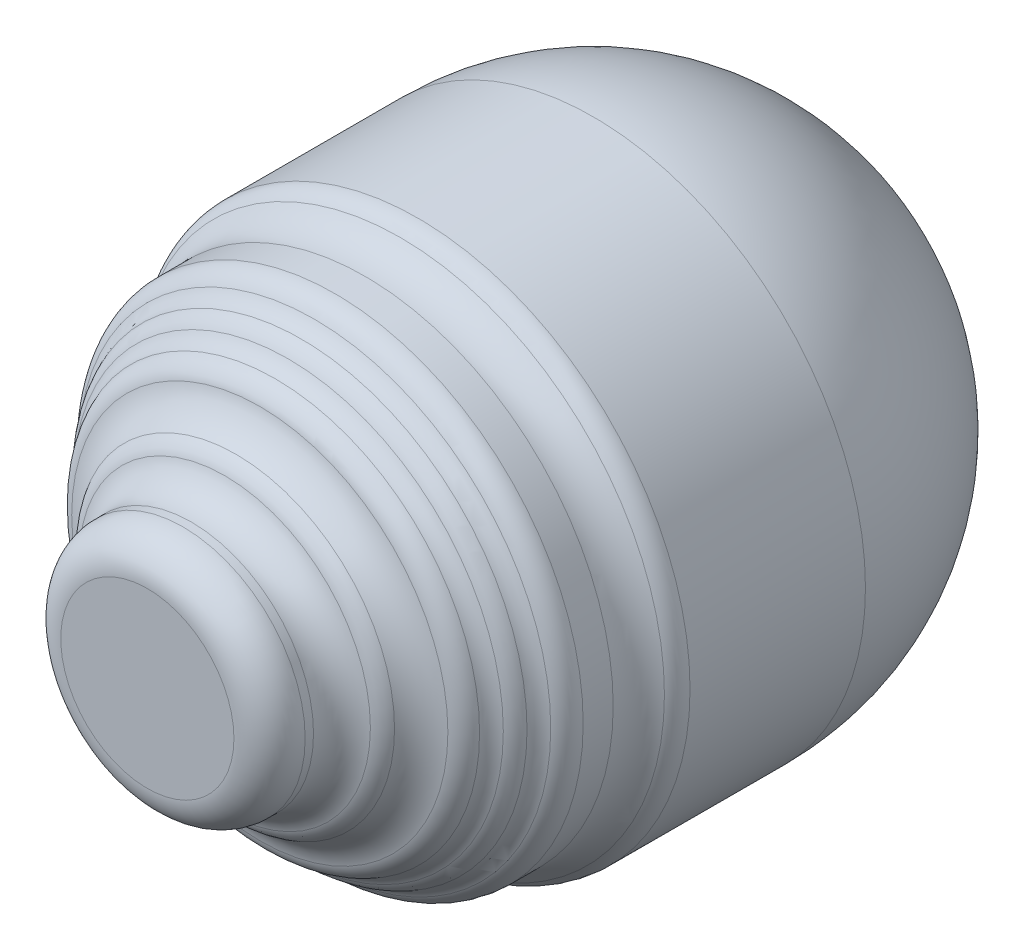
ISO-10303-21;
HEADER;
FILE_DESCRIPTION(('STEP AP214'),'2;1');
FILE_NAME('part.step','',(''),(''),'','','');
FILE_SCHEMA(('AUTOMOTIVE_DESIGN { 1 0 10303 214 1 1 1 1 }'));
ENDSEC;
DATA;
#1=APPLICATION_CONTEXT('core data for automotive mechanical design processes');
#2=APPLICATION_PROTOCOL_DEFINITION('international standard','automotive_design',2000,#1);
#3=PRODUCT_CONTEXT('',#1,'mechanical');
#4=PRODUCT('Part','Part','',(#3));
#5=PRODUCT_RELATED_PRODUCT_CATEGORY('part','',(#4));
#6=PRODUCT_DEFINITION_FORMATION('','',#4);
#7=PRODUCT_DEFINITION_CONTEXT('part definition',#1,'design');
#8=PRODUCT_DEFINITION('design','',#6,#7);
#9=PRODUCT_DEFINITION_SHAPE('','',#8);
#10=(LENGTH_UNIT() NAMED_UNIT(*) SI_UNIT(.MILLI.,.METRE.));
#11=(NAMED_UNIT(*) PLANE_ANGLE_UNIT() SI_UNIT($,.RADIAN.));
#12=(NAMED_UNIT(*) SI_UNIT($,.STERADIAN.) SOLID_ANGLE_UNIT());
#13=UNCERTAINTY_MEASURE_WITH_UNIT(LENGTH_MEASURE(1.E-05),#10,'distance_accuracy_value','');
#14=(GEOMETRIC_REPRESENTATION_CONTEXT(3) GLOBAL_UNCERTAINTY_ASSIGNED_CONTEXT((#13)) GLOBAL_UNIT_ASSIGNED_CONTEXT((#10,
#11,#12)) REPRESENTATION_CONTEXT('',''));
#15=CARTESIAN_POINT('',(0.,0.,0.));
#16=DIRECTION('',(0.,0.,1.));
#17=DIRECTION('',(1.,0.,0.));
#18=AXIS2_PLACEMENT_3D('',#15,#16,#17);
#19=CARTESIAN_POINT('',(-276.657629022015,0.,-36.6110210092373));
#20=DIRECTION('',(0.,0.,1.));
#21=DIRECTION('',(1.,0.,0.));
#22=AXIS2_PLACEMENT_3D('',#19,#20,#21);
#23=CYLINDRICAL_SURFACE('',#22,5.31171325408893);
#24=CARTESIAN_POINT('',(-276.657629022015,0.,-28.6008305416037));
#25=DIRECTION('',(0.,0.,1.));
#26=DIRECTION('',(1.,0.,0.));
#27=AXIS2_PLACEMENT_3D('',#24,#25,#26);
#28=CIRCLE('',#27,5.31171325408893);
#29=CARTESIAN_POINT('',(-271.345915767926,0.,-28.6008305416037));
#30=VERTEX_POINT('',#29);
#31=EDGE_CURVE('E115',#30,#30,#28,.T.);
#32=CARTESIAN_POINT('',(-276.657629022015,0.,37.5569789907627));
#33=DIRECTION('',(0.,0.,1.));
#34=DIRECTION('',(1.,0.,0.));
#35=AXIS2_PLACEMENT_3D('',#32,#33,#34);
#36=CIRCLE('',#35,5.31171325408893);
#37=CARTESIAN_POINT('',(-271.345915767926,0.,37.5569789907627));
#38=VERTEX_POINT('',#37);
#39=EDGE_CURVE('E10',#38,#38,#36,.F.);
#40=CARTESIAN_POINT('',(-271.345915767926,0.,-28.6008305416037));
#41=CARTESIAN_POINT('',(-271.345915767926,0.,-27.9116866923083));
#42=CARTESIAN_POINT('',(-271.345915767926,0.,-27.2225428430128));
#43=CARTESIAN_POINT('',(-271.345915767926,0.,-25.8442551444218));
#44=CARTESIAN_POINT('',(-271.345915767926,0.,-25.1551112951263));
#45=CARTESIAN_POINT('',(-271.345915767926,0.,-23.7768235965354));
#46=CARTESIAN_POINT('',(-271.345915767926,0.,-23.0876797472399));
#47=CARTESIAN_POINT('',(-271.345915767926,0.,-21.7093920486489));
#48=CARTESIAN_POINT('',(-271.345915767926,0.,-21.0202481993534));
#49=CARTESIAN_POINT('',(-271.345915767926,0.,-19.6419605007625));
#50=CARTESIAN_POINT('',(-271.345915767926,0.,-18.952816651467));
#51=CARTESIAN_POINT('',(-271.345915767926,0.,-17.574528952876));
#52=CARTESIAN_POINT('',(-271.345915767926,0.,-16.8853851035805));
#53=CARTESIAN_POINT('',(-271.345915767926,0.,-15.5070974049895));
#54=CARTESIAN_POINT('',(-271.345915767926,0.,-14.8179535556941));
#55=CARTESIAN_POINT('',(-271.345915767926,0.,-13.4396658571031));
#56=CARTESIAN_POINT('',(-271.345915767926,0.,-12.7505220078076));
#57=CARTESIAN_POINT('',(-271.345915767926,0.,-11.3722343092166));
#58=CARTESIAN_POINT('',(-271.345915767926,0.,-10.6830904599212));
#59=CARTESIAN_POINT('',(-271.345915767926,0.,-9.30480276133019));
#60=CARTESIAN_POINT('',(-271.345915767926,0.,-8.6156589120347));
#61=CARTESIAN_POINT('',(-271.345915767926,0.,-7.23737121344373));
#62=CARTESIAN_POINT('',(-271.345915767926,0.,-6.54822736414825));
#63=CARTESIAN_POINT('',(-271.345915767926,0.,-5.16993966555728));
#64=CARTESIAN_POINT('',(-271.345915767926,0.,-4.4807958162618));
#65=CARTESIAN_POINT('',(-271.345915767926,0.,-3.10250811767083));
#66=CARTESIAN_POINT('',(-271.345915767926,0.,-2.41336426837534));
#67=CARTESIAN_POINT('',(-271.345915767926,0.,-1.03507656978438));
#68=CARTESIAN_POINT('',(-271.345915767926,0.,-0.345932720488891));
#69=CARTESIAN_POINT('',(-271.345915767926,0.,1.03235497810208));
#70=CARTESIAN_POINT('',(-271.345915767926,0.,1.72149882739756));
#71=CARTESIAN_POINT('',(-271.345915767926,0.,3.09978652598853));
#72=CARTESIAN_POINT('',(-271.345915767926,0.,3.78893037528402));
#73=CARTESIAN_POINT('',(-271.345915767926,0.,5.16721807387498));
#74=CARTESIAN_POINT('',(-271.345915767926,0.,5.85636192317047));
#75=CARTESIAN_POINT('',(-271.345915767926,0.,7.23464962176144));
#76=CARTESIAN_POINT('',(-271.345915767926,0.,7.92379347105692));
#77=CARTESIAN_POINT('',(-271.345915767926,0.,9.30208116964789));
#78=CARTESIAN_POINT('',(-271.345915767926,0.,9.99122501894337));
#79=CARTESIAN_POINT('',(-271.345915767926,0.,11.3695127175343));
#80=CARTESIAN_POINT('',(-271.345915767926,0.,12.0586565668298));
#81=CARTESIAN_POINT('',(-271.345915767926,0.,13.4369442654208));
#82=CARTESIAN_POINT('',(-271.345915767926,0.,14.1260881147163));
#83=CARTESIAN_POINT('',(-271.345915767926,0.,15.5043758133072));
#84=CARTESIAN_POINT('',(-271.345915767926,0.,16.1935196626027));
#85=CARTESIAN_POINT('',(-271.345915767926,0.,17.5718073611937));
#86=CARTESIAN_POINT('',(-271.345915767926,0.,18.2609512104892));
#87=CARTESIAN_POINT('',(-271.345915767926,0.,19.6392389090802));
#88=CARTESIAN_POINT('',(-271.345915767926,0.,20.3283827583756));
#89=CARTESIAN_POINT('',(-271.345915767926,0.,21.7066704569666));
#90=CARTESIAN_POINT('',(-271.345915767926,0.,22.3958143062621));
#91=CARTESIAN_POINT('',(-271.345915767926,0.,23.7741020048531));
#92=CARTESIAN_POINT('',(-271.345915767926,0.,24.4632458541485));
#93=CARTESIAN_POINT('',(-271.345915767926,0.,25.8415335527395));
#94=CARTESIAN_POINT('',(-271.345915767926,0.,26.530677402035));
#95=CARTESIAN_POINT('',(-271.345915767926,0.,27.908965100626));
#96=CARTESIAN_POINT('',(-271.345915767926,0.,28.5981089499214));
#97=CARTESIAN_POINT('',(-271.345915767926,0.,29.9763966485124));
#98=CARTESIAN_POINT('',(-271.345915767926,0.,30.6655404978079));
#99=CARTESIAN_POINT('',(-271.345915767926,0.,32.0438281963989));
#100=CARTESIAN_POINT('',(-271.345915767926,0.,32.7329720456944));
#101=CARTESIAN_POINT('',(-271.345915767926,0.,34.1112597442853));
#102=CARTESIAN_POINT('',(-271.345915767926,0.,34.8004035935808));
#103=CARTESIAN_POINT('',(-271.345915767926,0.,36.1786912921718));
#104=CARTESIAN_POINT('',(-271.345915767926,0.,36.8678351414673));
#105=CARTESIAN_POINT('',(-271.345915767926,0.,37.5569789907627));
#106=B_SPLINE_CURVE_WITH_KNOTS('',3,(#40,#41,#42,#43,#44,#45,#46,#47,#48,#49,#50,#51,#52,#53,
#54,#55,#56,#57,#58,#59,#60,#61,#62,#63,#64,#65,#66,#67,#68,#69,#70,#71,#72,#73,#74,#75,#76,#77,
#78,#79,#80,#81,#82,#83,#84,#85,#86,#87,#88,#89,#90,#91,#92,#93,#94,#95,#96,#97,#98,#99,#100,
#101,#102,#103,#104,#105),.UNSPECIFIED.,.F.,.F.,(4,2,2,2,2,2,2,2,2,2,2,2,2,2,2,2,2,2,2,2,2,2,2,
2,2,2,2,2,2,2,2,2,4),(0.,2.06743154788645,4.13486309577291,6.20229464365936,8.26972619154581,
10.3371577394323,12.4045892873187,14.4720208352052,16.5394523830916,18.6068839309781,
20.6743154788645,22.741747026751,24.8091785746374,26.8766101225239,28.9440416704103,
31.0114732182968,33.0789047661832,35.1463363140697,37.2137678619562,39.2811994098426,
41.3486309577291,43.4160625056155,45.483494053502,47.5509256013884,49.6183571492749,
51.6857886971613,53.7532202450478,55.8206517929342,57.8880833408207,59.9555148887071,
62.0229464365936,64.09037798448,66.1578095323665),.UNSPECIFIED.);
#107=EDGE_CURVE('BSEAM43',#30,#38,#106,.T.);
#108=ORIENTED_EDGE('',*,*,#31,.F.);
#109=ORIENTED_EDGE('',*,*,#39,.F.);
#110=ORIENTED_EDGE('',*,*,#107,.T.);
#111=ORIENTED_EDGE('',*,*,#107,.F.);
#112=EDGE_LOOP('',(#108,#110,#109,#111));
#113=FACE_BOUND('',#112,.T.);
#114=ADVANCED_FACE('F43',(#113),#23,.F.);
#115=CARTESIAN_POINT('',(-276.657629022015,0.,0.));
#116=DIRECTION('',(-1.,0.,0.));
#117=DIRECTION('',(0.,1.,0.));
#118=AXIS2_PLACEMENT_3D('',#115,#116,#117);
#119=SPHERICAL_SURFACE('',#118,29.0898918073477);
#120=CARTESIAN_POINT('',(-276.657629022015,0.,0.));
#121=DIRECTION('',(0.,0.,1.));
#122=DIRECTION('',(1.,0.,0.));
#123=AXIS2_PLACEMENT_3D('',#120,#121,#122);
#124=SPHERICAL_SURFACE('',#123,29.0898918073477);
#125=ORIENTED_EDGE('',*,*,#31,.T.);
#126=EDGE_LOOP('',(#125));
#127=FACE_BOUND('',#126,.T.);
#128=CARTESIAN_POINT('',(-276.657629022015,0.,0.));
#129=DIRECTION('',(0.,0.,1.));
#130=DIRECTION('',(0.,-1.,0.));
#131=AXIS2_PLACEMENT_3D('',#128,#129,#130);
#132=CIRCLE('',#131,29.0898918073477);
#133=CARTESIAN_POINT('',(-276.657629022015,-29.0898918073477,-1.0156681439432E-13));
#134=VERTEX_POINT('',#133);
#135=EDGE_CURVE('E111',#134,#134,#132,.T.);
#136=ORIENTED_EDGE('',*,*,#135,.F.);
#137=EDGE_LOOP('',(#136));
#138=FACE_BOUND('',#137,.T.);
#139=ADVANCED_FACE('F120',(#127,#138),#124,.T.);
#140=CARTESIAN_POINT('',(-276.657629022015,0.,21.3009789907627));
#141=DIRECTION('',(0.,0.,-1.));
#142=DIRECTION('',(-1.,0.,0.));
#143=AXIS2_PLACEMENT_3D('',#140,#141,#142);
#144=CYLINDRICAL_SURFACE('',#143,29.0898918073477);
#145=CARTESIAN_POINT('',(-276.657629022015,0.,18.7609789907627));
#146=DIRECTION('',(0.,0.,1.));
#147=DIRECTION('',(1.,0.,0.));
#148=AXIS2_PLACEMENT_3D('',#145,#146,#147);
#149=CIRCLE('',#148,29.0898918073477);
#150=CARTESIAN_POINT('',(-247.567737214667,0.,18.7609789907627));
#151=VERTEX_POINT('',#150);
#152=EDGE_CURVE('E107',#151,#151,#149,.F.);
#153=ORIENTED_EDGE('',*,*,#152,.T.);
#154=EDGE_LOOP('',(#153));
#155=FACE_BOUND('',#154,.T.);
#156=ORIENTED_EDGE('',*,*,#135,.T.);
#157=EDGE_LOOP('',(#156));
#158=FACE_BOUND('',#157,.T.);
#159=ADVANCED_FACE('F129',(#155,#158),#144,.T.);
#160=CARTESIAN_POINT('',(-276.657629022015,0.,18.7609789907627));
#161=DIRECTION('',(0.,0.,1.));
#162=DIRECTION('',(1.,0.,0.));
#163=AXIS2_PLACEMENT_3D('',#160,#161,#162);
#164=TOROIDAL_SURFACE('',#163,26.5498918073477,2.54);
#165=CARTESIAN_POINT('',(-276.657629022015,0.,20.6541832117126));
#166=DIRECTION('',(0.,0.,-1.));
#167=DIRECTION('',(-1.,0.,0.));
#168=AXIS2_PLACEMENT_3D('',#165,#166,#167);
#169=CIRCLE('',#168,28.243225140681);
#170=CARTESIAN_POINT('',(-304.900854162696,0.,20.6541832117126));
#171=VERTEX_POINT('',#170);
#172=EDGE_CURVE('E51',#171,#171,#169,.T.);
#173=ORIENTED_EDGE('',*,*,#172,.T.);
#174=EDGE_LOOP('',(#173));
#175=FACE_BOUND('',#174,.T.);
#176=ORIENTED_EDGE('',*,*,#152,.F.);
#177=EDGE_LOOP('',(#176));
#178=FACE_BOUND('',#177,.T.);
#179=ADVANCED_FACE('F148',(#175,#178),#164,.T.);
#180=CARTESIAN_POINT('',(-276.657629022015,0.,30.1909789907627));
#181=DIRECTION('',(0.,0.,-1.));
#182=DIRECTION('',(-1.,0.,0.));
#183=AXIS2_PLACEMENT_3D('',#180,#181,#182);
#184=CYLINDRICAL_SURFACE('',#183,26.5498918073477);
#185=CARTESIAN_POINT('',(-276.657629022015,0.,24.4405916536122));
#186=DIRECTION('',(0.,0.,1.));
#187=DIRECTION('',(1.,0.,0.));
#188=AXIS2_PLACEMENT_3D('',#185,#186,#187);
#189=CIRCLE('',#188,26.5498918073477);
#190=CARTESIAN_POINT('',(-250.107737214667,0.,24.4405916536122));
#191=VERTEX_POINT('',#190);
#192=EDGE_CURVE('E56',#191,#191,#189,.T.);
#193=ORIENTED_EDGE('',*,*,#192,.T.);
#194=EDGE_LOOP('',(#193));
#195=FACE_BOUND('',#194,.T.);
#196=CARTESIAN_POINT('',(-276.657629022015,0.,27.6509789907627));
#197=DIRECTION('',(0.,0.,1.));
#198=DIRECTION('',(1.,0.,0.));
#199=AXIS2_PLACEMENT_3D('',#196,#197,#198);
#200=CIRCLE('',#199,26.5498918073477);
#201=CARTESIAN_POINT('',(-250.107737214667,0.,27.6509789907627));
#202=VERTEX_POINT('',#201);
#203=EDGE_CURVE('E103',#202,#202,#200,.F.);
#204=ORIENTED_EDGE('',*,*,#203,.T.);
#205=EDGE_LOOP('',(#204));
#206=FACE_BOUND('',#205,.T.);
#207=ADVANCED_FACE('F144',(#195,#206),#184,.T.);
#208=CARTESIAN_POINT('',(-276.657629022015,0.,27.6509789907627));
#209=DIRECTION('',(0.,0.,1.));
#210=DIRECTION('',(1.,0.,0.));
#211=AXIS2_PLACEMENT_3D('',#208,#209,#210);
#212=TOROIDAL_SURFACE('',#211,24.0098918073477,2.54);
#213=CARTESIAN_POINT('',(-276.657629022015,0.,29.8506835163752));
#214=DIRECTION('',(0.,0.,-1.));
#215=DIRECTION('',(-1.,0.,0.));
#216=AXIS2_PLACEMENT_3D('',#213,#214,#215);
#217=CIRCLE('',#216,25.2798918073477);
#218=CARTESIAN_POINT('',(-301.937520829363,0.,29.8506835163752));
#219=VERTEX_POINT('',#218);
#220=EDGE_CURVE('E99',#219,#219,#217,.T.);
#221=ORIENTED_EDGE('',*,*,#220,.T.);
#222=EDGE_LOOP('',(#221));
#223=FACE_BOUND('',#222,.T.);
#224=ORIENTED_EDGE('',*,*,#203,.F.);
#225=EDGE_LOOP('',(#224));
#226=FACE_BOUND('',#225,.T.);
#227=ADVANCED_FACE('F147',(#223,#226),#212,.T.);
#228=CARTESIAN_POINT('',(-276.657629022015,0.,32.0503880419877));
#229=DIRECTION('',(0.,0.,1.));
#230=DIRECTION('',(1.,0.,0.));
#231=AXIS2_PLACEMENT_3D('',#228,#229,#230);
#232=TOROIDAL_SURFACE('',#231,26.5498918073477,2.54);
#233=CARTESIAN_POINT('',(-276.657629022015,0.,31.2476835163752));
#234=DIRECTION('',(0.,0.,1.));
#235=DIRECTION('',(1.,0.,0.));
#236=AXIS2_PLACEMENT_3D('',#233,#234,#235);
#237=CIRCLE('',#236,24.1400649578497);
#238=CARTESIAN_POINT('',(-252.517564064165,0.,31.2476835163752));
#239=VERTEX_POINT('',#238);
#240=EDGE_CURVE('E95',#239,#239,#237,.F.);
#241=ORIENTED_EDGE('',*,*,#240,.T.);
#242=EDGE_LOOP('',(#241));
#243=FACE_BOUND('',#242,.T.);
#244=ORIENTED_EDGE('',*,*,#220,.F.);
#245=EDGE_LOOP('',(#244));
#246=FACE_BOUND('',#245,.T.);
#247=ADVANCED_FACE('F157',(#243,#246),#232,.F.);
#248=CARTESIAN_POINT('',(-276.657629022015,0.,30.4449789907627));
#249=DIRECTION('',(0.,0.,-1.));
#250=DIRECTION('',(-1.,0.,0.));
#251=AXIS2_PLACEMENT_3D('',#248,#249,#250);
#252=TOROIDAL_SURFACE('',#251,21.7302381083518,2.54);
#253=CARTESIAN_POINT('',(-276.657629022015,0.,32.6446835163752));
#254=DIRECTION('',(0.,0.,-1.));
#255=DIRECTION('',(-1.,0.,0.));
#256=AXIS2_PLACEMENT_3D('',#253,#254,#255);
#257=CIRCLE('',#256,23.0002381083518);
#258=CARTESIAN_POINT('',(-299.657867130367,0.,32.6446835163752));
#259=VERTEX_POINT('',#258);
#260=EDGE_CURVE('E91',#259,#259,#257,.T.);
#261=ORIENTED_EDGE('',*,*,#260,.T.);
#262=EDGE_LOOP('',(#261));
#263=FACE_BOUND('',#262,.T.);
#264=ORIENTED_EDGE('',*,*,#240,.F.);
#265=EDGE_LOOP('',(#264));
#266=FACE_BOUND('',#265,.T.);
#267=ADVANCED_FACE('F161',(#263,#266),#252,.T.);
#268=CARTESIAN_POINT('',(-276.657629022015,0.,34.8443880419877));
#269=DIRECTION('',(0.,0.,1.));
#270=DIRECTION('',(1.,0.,0.));
#271=AXIS2_PLACEMENT_3D('',#268,#269,#270);
#272=TOROIDAL_SURFACE('',#271,24.2702381083518,2.54);
#273=CARTESIAN_POINT('',(-276.657629022015,0.,34.0416835163752));
#274=DIRECTION('',(0.,0.,1.));
#275=DIRECTION('',(1.,0.,0.));
#276=AXIS2_PLACEMENT_3D('',#273,#274,#275);
#277=CIRCLE('',#276,21.8604112588538);
#278=CARTESIAN_POINT('',(-254.797217763161,0.,34.0416835163752));
#279=VERTEX_POINT('',#278);
#280=EDGE_CURVE('E87',#279,#279,#277,.F.);
#281=ORIENTED_EDGE('',*,*,#280,.T.);
#282=EDGE_LOOP('',(#281));
#283=FACE_BOUND('',#282,.T.);
#284=ORIENTED_EDGE('',*,*,#260,.F.);
#285=EDGE_LOOP('',(#284));
#286=FACE_BOUND('',#285,.T.);
#287=ADVANCED_FACE('F165',(#283,#286),#272,.F.);
#288=CARTESIAN_POINT('',(-276.657629022015,0.,33.2389789907628));
#289=DIRECTION('',(0.,0.,-1.));
#290=DIRECTION('',(-1.,0.,0.));
#291=AXIS2_PLACEMENT_3D('',#288,#289,#290);
#292=TOROIDAL_SURFACE('',#291,19.4505844093558,2.54);
#293=CARTESIAN_POINT('',(-276.657629022015,0.,35.6899204522896));
#294=DIRECTION('',(0.,0.,-1.));
#295=DIRECTION('',(-1.,0.,0.));
#296=AXIS2_PLACEMENT_3D('',#293,#294,#295);
#297=CIRCLE('',#296,20.1172822060881);
#298=CARTESIAN_POINT('',(-296.774911228103,0.,35.6899204522896));
#299=VERTEX_POINT('',#298);
#300=EDGE_CURVE('E83',#299,#299,#297,.T.);
#301=ORIENTED_EDGE('',*,*,#300,.T.);
#302=EDGE_LOOP('',(#301));
#303=FACE_BOUND('',#302,.T.);
#304=ORIENTED_EDGE('',*,*,#280,.F.);
#305=EDGE_LOOP('',(#304));
#306=FACE_BOUND('',#305,.T.);
#307=ADVANCED_FACE('F169',(#303,#306),#292,.T.);
#308=CARTESIAN_POINT('',(-276.657629022015,0.,40.5918033753439));
#309=DIRECTION('',(0.,0.,-1.));
#310=DIRECTION('',(-1.,0.,0.));
#311=AXIS2_PLACEMENT_3D('',#308,#309,#310);
#312=TOROIDAL_SURFACE('',#311,21.4506777995528,5.08);
#313=CARTESIAN_POINT('',(-276.657629022015,0.,38.2299204522898));
#314=DIRECTION('',(0.,0.,1.));
#315=DIRECTION('',(1.,0.,0.));
#316=AXIS2_PLACEMENT_3D('',#313,#314,#315);
#317=CIRCLE('',#316,16.9531330184766);
#318=CARTESIAN_POINT('',(-259.704496003539,0.,38.2299204522898));
#319=VERTEX_POINT('',#318);
#320=EDGE_CURVE('E79',#319,#319,#317,.F.);
#321=ORIENTED_EDGE('',*,*,#320,.T.);
#322=EDGE_LOOP('',(#321));
#323=FACE_BOUND('',#322,.T.);
#324=ORIENTED_EDGE('',*,*,#300,.F.);
#325=EDGE_LOOP('',(#324));
#326=FACE_BOUND('',#325,.T.);
#327=ADVANCED_FACE('F173',(#323,#326),#312,.F.);
#328=CARTESIAN_POINT('',(-276.657629022015,0.,37.0489789907628));
#329=DIRECTION('',(0.,0.,-1.));
#330=DIRECTION('',(-1.,0.,0.));
#331=AXIS2_PLACEMENT_3D('',#328,#329,#330);
#332=TOROIDAL_SURFACE('',#331,14.7043606279385,2.54);
#333=CARTESIAN_POINT('',(-276.657629022015,0.,39.4349201001855));
#334=DIRECTION('',(0.,0.,-1.));
#335=DIRECTION('',(-1.,0.,0.));
#336=AXIS2_PLACEMENT_3D('',#333,#334,#335);
#337=CIRCLE('',#336,15.5755006984019);
#338=CARTESIAN_POINT('',(-292.233129720417,0.,39.4349201001855));
#339=VERTEX_POINT('',#338);
#340=EDGE_CURVE('E61',#339,#339,#337,.T.);
#341=ORIENTED_EDGE('',*,*,#340,.T.);
#342=EDGE_LOOP('',(#341));
#343=FACE_BOUND('',#342,.T.);
#344=ORIENTED_EDGE('',*,*,#320,.F.);
#345=EDGE_LOOP('',(#344));
#346=FACE_BOUND('',#345,.T.);
#347=ADVANCED_FACE('F142',(#343,#346),#332,.T.);
#348=CARTESIAN_POINT('',(-276.657629022015,0.,47.7169789907628));
#349=DIRECTION('',(0.,0.,-1.));
#350=DIRECTION('',(-1.,0.,0.));
#351=AXIS2_PLACEMENT_3D('',#348,#349,#350);
#352=CYLINDRICAL_SURFACE('',#351,13.072210804097);
#353=CARTESIAN_POINT('',(-276.657629022015,0.,43.0138317643194));
#354=DIRECTION('',(0.,0.,1.));
#355=DIRECTION('',(1.,0.,0.));
#356=AXIS2_PLACEMENT_3D('',#353,#354,#355);
#357=CIRCLE('',#356,13.072210804097);
#358=CARTESIAN_POINT('',(-263.585418217918,0.,43.0138317643194));
#359=VERTEX_POINT('',#358);
#360=EDGE_CURVE('E67',#359,#359,#357,.T.);
#361=ORIENTED_EDGE('',*,*,#360,.T.);
#362=EDGE_LOOP('',(#361));
#363=FACE_BOUND('',#362,.T.);
#364=CARTESIAN_POINT('',(-276.657629022015,0.,43.9069789907628));
#365=DIRECTION('',(0.,0.,1.));
#366=DIRECTION('',(1.,0.,0.));
#367=AXIS2_PLACEMENT_3D('',#364,#365,#366);
#368=CIRCLE('',#367,13.072210804097);
#369=CARTESIAN_POINT('',(-263.585418217918,0.,43.9069789907628));
#370=VERTEX_POINT('',#369);
#371=EDGE_CURVE('E71',#370,#370,#368,.F.);
#372=ORIENTED_EDGE('',*,*,#371,.T.);
#373=EDGE_LOOP('',(#372));
#374=FACE_BOUND('',#373,.T.);
#375=ADVANCED_FACE('F138',(#363,#374),#352,.T.);
#376=CARTESIAN_POINT('',(-276.657629022015,0.,47.7169789907628));
#377=DIRECTION('',(0.,0.,1.));
#378=DIRECTION('',(1.,0.,0.));
#379=AXIS2_PLACEMENT_3D('',#376,#377,#378);
#380=PLANE('',#379);
#381=CARTESIAN_POINT('',(-276.657629022015,0.,47.7169789907628));
#382=DIRECTION('',(0.,0.,1.));
#383=DIRECTION('',(1.,0.,0.));
#384=AXIS2_PLACEMENT_3D('',#381,#382,#383);
#385=CIRCLE('',#384,9.26221080409704);
#386=CARTESIAN_POINT('',(-267.395418217918,0.,47.7169789907628));
#387=VERTEX_POINT('',#386);
#388=EDGE_CURVE('E75',#387,#387,#385,.T.);
#389=ORIENTED_EDGE('',*,*,#388,.T.);
#390=EDGE_LOOP('',(#389));
#391=FACE_BOUND('',#390,.T.);
#392=ADVANCED_FACE('F134',(#391),#380,.T.);
#393=CARTESIAN_POINT('',(-276.657629022015,0.,43.9069789907628));
#394=DIRECTION('',(0.,0.,1.));
#395=DIRECTION('',(1.,0.,0.));
#396=AXIS2_PLACEMENT_3D('',#393,#394,#395);
#397=TOROIDAL_SURFACE('',#396,9.26221080409704,3.81);
#398=ORIENTED_EDGE('',*,*,#371,.F.);
#399=EDGE_LOOP('',(#398));
#400=FACE_BOUND('',#399,.T.);
#401=ORIENTED_EDGE('',*,*,#388,.F.);
#402=EDGE_LOOP('',(#401));
#403=FACE_BOUND('',#402,.T.);
#404=ADVANCED_FACE('F137',(#400,#403),#397,.T.);
#405=CARTESIAN_POINT('',(-276.657629022015,0.,43.0138317643194));
#406=DIRECTION('',(0.,0.,1.));
#407=DIRECTION('',(1.,0.,0.));
#408=AXIS2_PLACEMENT_3D('',#405,#406,#407);
#409=TOROIDAL_SURFACE('',#408,16.882210804097,3.81);
#410=ORIENTED_EDGE('',*,*,#340,.F.);
#411=EDGE_LOOP('',(#410));
#412=FACE_BOUND('',#411,.T.);
#413=ORIENTED_EDGE('',*,*,#360,.F.);
#414=EDGE_LOOP('',(#413));
#415=FACE_BOUND('',#414,.T.);
#416=ADVANCED_FACE('F182',(#412,#415),#409,.F.);
#417=CARTESIAN_POINT('',(-276.657629022015,0.,24.4405916536122));
#418=DIRECTION('',(0.,0.,1.));
#419=DIRECTION('',(1.,0.,0.));
#420=AXIS2_PLACEMENT_3D('',#417,#418,#419);
#421=TOROIDAL_SURFACE('',#420,31.6298918073477,5.08);
#422=ORIENTED_EDGE('',*,*,#172,.F.);
#423=EDGE_LOOP('',(#422));
#424=FACE_BOUND('',#423,.T.);
#425=ORIENTED_EDGE('',*,*,#192,.F.);
#426=EDGE_LOOP('',(#425));
#427=FACE_BOUND('',#426,.T.);
#428=ADVANCED_FACE('F45',(#424,#427),#421,.F.);
#429=CARTESIAN_POINT('',(-276.657629022015,0.,37.5569789907627));
#430=DIRECTION('',(0.,0.,1.));
#431=DIRECTION('',(1.,0.,0.));
#432=AXIS2_PLACEMENT_3D('',#429,#430,#431);
#433=PLANE('',#432);
#434=ORIENTED_EDGE('',*,*,#39,.T.);
#435=EDGE_LOOP('',(#434));
#436=FACE_BOUND('',#435,.T.);
#437=ADVANCED_FACE('F133',(#436),#433,.F.);
#438=CLOSED_SHELL('',(#114,#139,#159,#179,#207,#227,#247,#267,#287,#307,#327,#347,#375,#392,
#404,#416,#428,#437));
#439=MANIFOLD_SOLID_BREP('B2',#438);
#440=ADVANCED_BREP_SHAPE_REPRESENTATION('',(#18,#439),#14);
#441=SHAPE_DEFINITION_REPRESENTATION(#9,#440);
ENDSEC;
END-ISO-10303-21;
